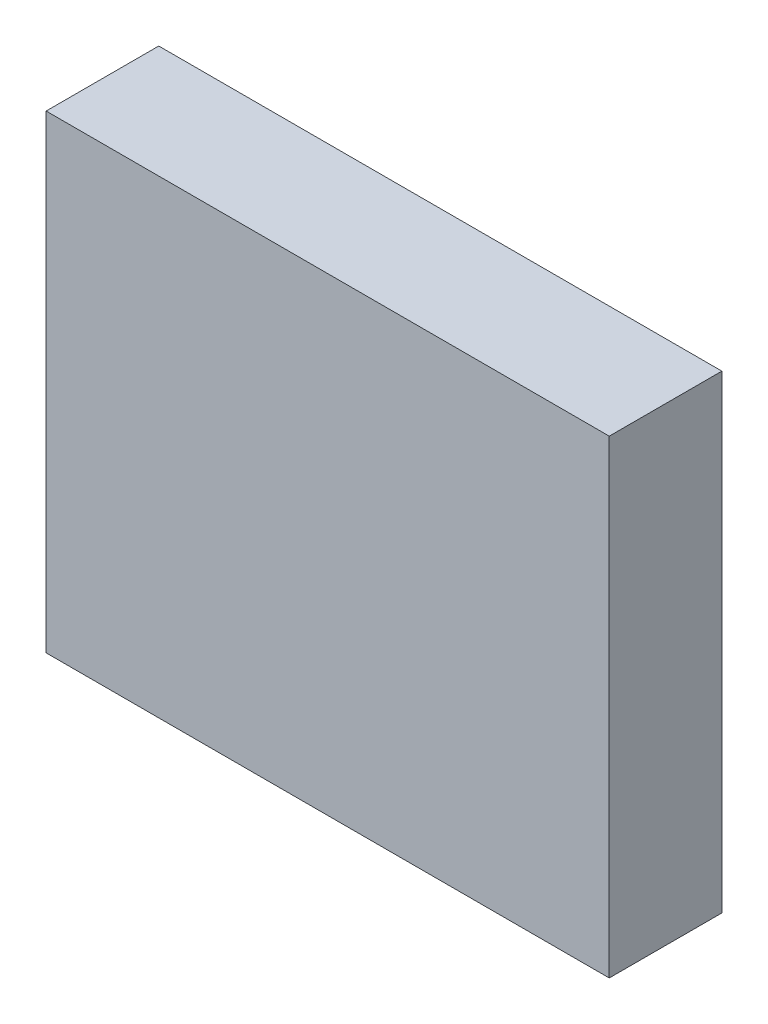
ISO-10303-21;
HEADER;
FILE_DESCRIPTION(('STEP AP214'),'2;1');
FILE_NAME('part.step','',(''),(''),'','','');
FILE_SCHEMA(('AUTOMOTIVE_DESIGN { 1 0 10303 214 1 1 1 1 }'));
ENDSEC;
DATA;
#1=APPLICATION_CONTEXT('core data for automotive mechanical design processes');
#2=APPLICATION_PROTOCOL_DEFINITION('international standard','automotive_design',2000,#1);
#3=PRODUCT_CONTEXT('',#1,'mechanical');
#4=PRODUCT('Part','Part','',(#3));
#5=PRODUCT_RELATED_PRODUCT_CATEGORY('part','',(#4));
#6=PRODUCT_DEFINITION_FORMATION('','',#4);
#7=PRODUCT_DEFINITION_CONTEXT('part definition',#1,'design');
#8=PRODUCT_DEFINITION('design','',#6,#7);
#9=PRODUCT_DEFINITION_SHAPE('','',#8);
#10=(LENGTH_UNIT() NAMED_UNIT(*) SI_UNIT(.MILLI.,.METRE.));
#11=(NAMED_UNIT(*) PLANE_ANGLE_UNIT() SI_UNIT($,.RADIAN.));
#12=(NAMED_UNIT(*) SI_UNIT($,.STERADIAN.) SOLID_ANGLE_UNIT());
#13=UNCERTAINTY_MEASURE_WITH_UNIT(LENGTH_MEASURE(1.E-05),#10,'distance_accuracy_value','');
#14=(GEOMETRIC_REPRESENTATION_CONTEXT(3) GLOBAL_UNCERTAINTY_ASSIGNED_CONTEXT((#13)) GLOBAL_UNIT_ASSIGNED_CONTEXT((#10,
#11,#12)) REPRESENTATION_CONTEXT('',''));
#15=CARTESIAN_POINT('',(0.,0.,0.));
#16=DIRECTION('',(0.,0.,1.));
#17=DIRECTION('',(1.,0.,0.));
#18=AXIS2_PLACEMENT_3D('',#15,#16,#17);
#19=CARTESIAN_POINT('',(300.,1680.,-300.));
#20=DIRECTION('',(-1.,0.,0.));
#21=DIRECTION('',(0.,0.,1.));
#22=AXIS2_PLACEMENT_3D('',#19,#20,#21);
#23=PLANE('',#22);
#24=DIRECTION('',(0.,-1.,0.));
#25=VECTOR('',#24,1.);
#26=CARTESIAN_POINT('',(300.,1680.,-240.));
#27=LINE('',#26,#25);
#28=CARTESIAN_POINT('',(300.,1930.,-240.));
#29=VERTEX_POINT('',#28);
#30=CARTESIAN_POINT('',(300.,1680.,-240.));
#31=VERTEX_POINT('',#30);
#32=EDGE_CURVE('E103',#29,#31,#27,.T.);
#33=ORIENTED_EDGE('',*,*,#32,.F.);
#34=DIRECTION('',(0.,0.,1.));
#35=VECTOR('',#34,1.);
#36=CARTESIAN_POINT('',(300.,1930.,-300.));
#37=LINE('',#36,#35);
#38=CARTESIAN_POINT('',(300.,1930.,-300.));
#39=VERTEX_POINT('',#38);
#40=EDGE_CURVE('E11',#39,#29,#37,.T.);
#41=ORIENTED_EDGE('',*,*,#40,.F.);
#42=DIRECTION('',(0.,-1.,0.));
#43=VECTOR('',#42,1.);
#44=CARTESIAN_POINT('',(300.,1680.,-300.));
#45=LINE('',#44,#43);
#46=CARTESIAN_POINT('',(300.,1680.,-300.));
#47=VERTEX_POINT('',#46);
#48=EDGE_CURVE('E97',#39,#47,#45,.T.);
#49=ORIENTED_EDGE('',*,*,#48,.T.);
#50=DIRECTION('',(0.,0.,1.));
#51=VECTOR('',#50,1.);
#52=CARTESIAN_POINT('',(300.,1680.,-300.));
#53=LINE('',#52,#51);
#54=EDGE_CURVE('E42',#47,#31,#53,.T.);
#55=ORIENTED_EDGE('',*,*,#54,.T.);
#56=EDGE_LOOP('',(#33,#41,#49,#55));
#57=FACE_BOUND('',#56,.T.);
#58=ADVANCED_FACE('F39',(#57),#23,.T.);
#59=CARTESIAN_POINT('',(300.,1930.,-300.));
#60=DIRECTION('',(0.,1.,0.));
#61=DIRECTION('',(0.,0.,1.));
#62=AXIS2_PLACEMENT_3D('',#59,#60,#61);
#63=PLANE('',#62);
#64=DIRECTION('',(-1.,0.,0.));
#65=VECTOR('',#64,1.);
#66=CARTESIAN_POINT('',(300.,1930.,-240.));
#67=LINE('',#66,#65);
#68=CARTESIAN_POINT('',(600.,1930.,-240.));
#69=VERTEX_POINT('',#68);
#70=EDGE_CURVE('E99',#69,#29,#67,.T.);
#71=ORIENTED_EDGE('',*,*,#70,.F.);
#72=DIRECTION('',(0.,0.,1.));
#73=VECTOR('',#72,1.);
#74=CARTESIAN_POINT('',(600.,1930.,-300.));
#75=LINE('',#74,#73);
#76=CARTESIAN_POINT('',(600.,1930.,-300.));
#77=VERTEX_POINT('',#76);
#78=EDGE_CURVE('E48',#77,#69,#75,.T.);
#79=ORIENTED_EDGE('',*,*,#78,.F.);
#80=DIRECTION('',(-1.,0.,0.));
#81=VECTOR('',#80,1.);
#82=CARTESIAN_POINT('',(300.,1930.,-300.));
#83=LINE('',#82,#81);
#84=EDGE_CURVE('E94',#77,#39,#83,.T.);
#85=ORIENTED_EDGE('',*,*,#84,.T.);
#86=ORIENTED_EDGE('',*,*,#40,.T.);
#87=EDGE_LOOP('',(#71,#79,#85,#86));
#88=FACE_BOUND('',#87,.T.);
#89=ADVANCED_FACE('F113',(#88),#63,.T.);
#90=CARTESIAN_POINT('',(600.,1680.,-300.));
#91=DIRECTION('',(1.,0.,0.));
#92=DIRECTION('',(0.,0.,-1.));
#93=AXIS2_PLACEMENT_3D('',#90,#91,#92);
#94=PLANE('',#93);
#95=DIRECTION('',(0.,1.,0.));
#96=VECTOR('',#95,1.);
#97=CARTESIAN_POINT('',(600.,1680.,-240.));
#98=LINE('',#97,#96);
#99=CARTESIAN_POINT('',(600.,1680.,-240.));
#100=VERTEX_POINT('',#99);
#101=EDGE_CURVE('E89',#100,#69,#98,.T.);
#102=ORIENTED_EDGE('',*,*,#101,.F.);
#103=DIRECTION('',(0.,0.,1.));
#104=VECTOR('',#103,1.);
#105=CARTESIAN_POINT('',(600.,1680.,-300.));
#106=LINE('',#105,#104);
#107=CARTESIAN_POINT('',(600.,1680.,-300.));
#108=VERTEX_POINT('',#107);
#109=EDGE_CURVE('E84',#108,#100,#106,.T.);
#110=ORIENTED_EDGE('',*,*,#109,.F.);
#111=DIRECTION('',(0.,1.,0.));
#112=VECTOR('',#111,1.);
#113=CARTESIAN_POINT('',(600.,1680.,-300.));
#114=LINE('',#113,#112);
#115=EDGE_CURVE('E87',#108,#77,#114,.T.);
#116=ORIENTED_EDGE('',*,*,#115,.T.);
#117=ORIENTED_EDGE('',*,*,#78,.T.);
#118=EDGE_LOOP('',(#102,#110,#116,#117));
#119=FACE_BOUND('',#118,.T.);
#120=ADVANCED_FACE('F86',(#119),#94,.T.);
#121=CARTESIAN_POINT('',(300.,1680.,-300.));
#122=DIRECTION('',(0.,-1.,0.));
#123=DIRECTION('',(0.,0.,-1.));
#124=AXIS2_PLACEMENT_3D('',#121,#122,#123);
#125=PLANE('',#124);
#126=DIRECTION('',(1.,0.,0.));
#127=VECTOR('',#126,1.);
#128=CARTESIAN_POINT('',(300.,1680.,-240.));
#129=LINE('',#128,#127);
#130=EDGE_CURVE('E106',#31,#100,#129,.T.);
#131=ORIENTED_EDGE('',*,*,#130,.F.);
#132=ORIENTED_EDGE('',*,*,#54,.F.);
#133=DIRECTION('',(1.,0.,0.));
#134=VECTOR('',#133,1.);
#135=CARTESIAN_POINT('',(300.,1680.,-300.));
#136=LINE('',#135,#134);
#137=EDGE_CURVE('E93',#47,#108,#136,.T.);
#138=ORIENTED_EDGE('',*,*,#137,.T.);
#139=ORIENTED_EDGE('',*,*,#109,.T.);
#140=EDGE_LOOP('',(#131,#132,#138,#139));
#141=FACE_BOUND('',#140,.T.);
#142=ADVANCED_FACE('F96',(#141),#125,.T.);
#143=CARTESIAN_POINT('',(0.,0.,-300.));
#144=DIRECTION('',(0.,0.,-1.));
#145=DIRECTION('',(-1.,0.,0.));
#146=AXIS2_PLACEMENT_3D('',#143,#144,#145);
#147=PLANE('',#146);
#148=ORIENTED_EDGE('',*,*,#48,.F.);
#149=ORIENTED_EDGE('',*,*,#84,.F.);
#150=ORIENTED_EDGE('',*,*,#115,.F.);
#151=ORIENTED_EDGE('',*,*,#137,.F.);
#152=EDGE_LOOP('',(#148,#149,#150,#151));
#153=FACE_BOUND('',#152,.T.);
#154=ADVANCED_FACE('F92',(#153),#147,.T.);
#155=CARTESIAN_POINT('',(0.,0.,-240.));
#156=DIRECTION('',(0.,0.,-1.));
#157=DIRECTION('',(-1.,0.,0.));
#158=AXIS2_PLACEMENT_3D('',#155,#156,#157);
#159=PLANE('',#158);
#160=ORIENTED_EDGE('',*,*,#32,.T.);
#161=ORIENTED_EDGE('',*,*,#130,.T.);
#162=ORIENTED_EDGE('',*,*,#101,.T.);
#163=ORIENTED_EDGE('',*,*,#70,.T.);
#164=EDGE_LOOP('',(#160,#161,#162,#163));
#165=FACE_BOUND('',#164,.T.);
#166=ADVANCED_FACE('F112',(#165),#159,.F.);
#167=CLOSED_SHELL('',(#58,#89,#120,#142,#154,#166));
#168=MANIFOLD_SOLID_BREP('B2',#167);
#169=ADVANCED_BREP_SHAPE_REPRESENTATION('',(#18,#168),#14);
#170=SHAPE_DEFINITION_REPRESENTATION(#9,#169);
ENDSEC;
END-ISO-10303-21;
